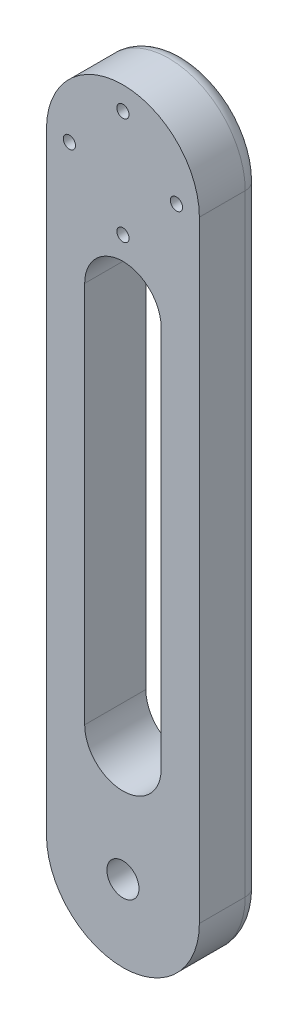
ISO-10303-21;
HEADER;
FILE_DESCRIPTION(('STEP AP214'),'2;1');
FILE_NAME('part.step','',(''),(''),'','','');
FILE_SCHEMA(('AUTOMOTIVE_DESIGN { 1 0 10303 214 1 1 1 1 }'));
ENDSEC;
DATA;
#1=APPLICATION_CONTEXT('core data for automotive mechanical design processes');
#2=APPLICATION_PROTOCOL_DEFINITION('international standard','automotive_design',2000,#1);
#3=PRODUCT_CONTEXT('',#1,'mechanical');
#4=PRODUCT('Part','Part','',(#3));
#5=PRODUCT_RELATED_PRODUCT_CATEGORY('part','',(#4));
#6=PRODUCT_DEFINITION_FORMATION('','',#4);
#7=PRODUCT_DEFINITION_CONTEXT('part definition',#1,'design');
#8=PRODUCT_DEFINITION('design','',#6,#7);
#9=PRODUCT_DEFINITION_SHAPE('','',#8);
#10=(LENGTH_UNIT() NAMED_UNIT(*) SI_UNIT(.MILLI.,.METRE.));
#11=(NAMED_UNIT(*) PLANE_ANGLE_UNIT() SI_UNIT($,.RADIAN.));
#12=(NAMED_UNIT(*) SI_UNIT($,.STERADIAN.) SOLID_ANGLE_UNIT());
#13=UNCERTAINTY_MEASURE_WITH_UNIT(LENGTH_MEASURE(1.E-05),#10,'distance_accuracy_value','');
#14=(GEOMETRIC_REPRESENTATION_CONTEXT(3) GLOBAL_UNCERTAINTY_ASSIGNED_CONTEXT((#13)) GLOBAL_UNIT_ASSIGNED_CONTEXT((#10,
#11,#12)) REPRESENTATION_CONTEXT('',''));
#15=CARTESIAN_POINT('',(0.,0.,0.));
#16=DIRECTION('',(0.,0.,1.));
#17=DIRECTION('',(1.,0.,0.));
#18=AXIS2_PLACEMENT_3D('',#15,#16,#17);
#19=CARTESIAN_POINT('',(0.,-80.,8.));
#20=DIRECTION('',(0.,0.,-1.));
#21=DIRECTION('',(-1.,0.,0.));
#22=AXIS2_PLACEMENT_3D('',#19,#20,#21);
#23=CYLINDRICAL_SURFACE('',#22,10.);
#24=DIRECTION('',(0.,0.,-1.));
#25=VECTOR('',#24,1.);
#26=CARTESIAN_POINT('',(-10.,-80.,8.));
#27=LINE('',#26,#25);
#28=CARTESIAN_POINT('',(-10.,-80.,8.));
#29=VERTEX_POINT('',#28);
#30=CARTESIAN_POINT('',(-10.,-80.,2.));
#31=VERTEX_POINT('',#30);
#32=EDGE_CURVE('E200',#29,#31,#27,.T.);
#33=ORIENTED_EDGE('',*,*,#32,.T.);
#34=CARTESIAN_POINT('',(0.,-80.,2.));
#35=DIRECTION('',(0.,0.,1.));
#36=DIRECTION('',(1.,0.,0.));
#37=AXIS2_PLACEMENT_3D('',#34,#35,#36);
#38=CIRCLE('',#37,10.);
#39=CARTESIAN_POINT('',(10.,-80.,2.));
#40=VERTEX_POINT('',#39);
#41=EDGE_CURVE('E235',#31,#40,#38,.T.);
#42=ORIENTED_EDGE('',*,*,#41,.T.);
#43=DIRECTION('',(0.,0.,-1.));
#44=VECTOR('',#43,1.);
#45=CARTESIAN_POINT('',(10.,-80.,8.));
#46=LINE('',#45,#44);
#47=CARTESIAN_POINT('',(10.,-80.,8.));
#48=VERTEX_POINT('',#47);
#49=EDGE_CURVE('E231',#48,#40,#46,.T.);
#50=ORIENTED_EDGE('',*,*,#49,.F.);
#51=CARTESIAN_POINT('',(0.,-80.,8.));
#52=DIRECTION('',(0.,0.,1.));
#53=DIRECTION('',(1.,0.,0.));
#54=AXIS2_PLACEMENT_3D('',#51,#52,#53);
#55=CIRCLE('',#54,10.);
#56=EDGE_CURVE('E166',#29,#48,#55,.T.);
#57=ORIENTED_EDGE('',*,*,#56,.F.);
#58=EDGE_LOOP('',(#33,#42,#50,#57));
#59=FACE_BOUND('',#58,.T.);
#60=ADVANCED_FACE('F40',(#59),#23,.T.);
#61=CARTESIAN_POINT('',(10.,0.,8.));
#62=DIRECTION('',(-1.,0.,0.));
#63=DIRECTION('',(0.,0.,1.));
#64=AXIS2_PLACEMENT_3D('',#61,#62,#63);
#65=PLANE('',#64);
#66=ORIENTED_EDGE('',*,*,#49,.T.);
#67=DIRECTION('',(0.,1.,0.));
#68=VECTOR('',#67,1.);
#69=CARTESIAN_POINT('',(10.,0.,2.));
#70=LINE('',#69,#68);
#71=CARTESIAN_POINT('',(10.,0.,2.));
#72=VERTEX_POINT('',#71);
#73=EDGE_CURVE('E11',#40,#72,#70,.T.);
#74=ORIENTED_EDGE('',*,*,#73,.T.);
#75=DIRECTION('',(0.,0.,-1.));
#76=VECTOR('',#75,1.);
#77=CARTESIAN_POINT('',(10.,0.,8.));
#78=LINE('',#77,#76);
#79=CARTESIAN_POINT('',(10.,0.,8.));
#80=VERTEX_POINT('',#79);
#81=EDGE_CURVE('E227',#80,#72,#78,.T.);
#82=ORIENTED_EDGE('',*,*,#81,.F.);
#83=DIRECTION('',(0.,1.,0.));
#84=VECTOR('',#83,1.);
#85=CARTESIAN_POINT('',(10.,0.,8.));
#86=LINE('',#85,#84);
#87=EDGE_CURVE('E170',#48,#80,#86,.T.);
#88=ORIENTED_EDGE('',*,*,#87,.F.);
#89=EDGE_LOOP('',(#66,#74,#82,#88));
#90=FACE_BOUND('',#89,.T.);
#91=ADVANCED_FACE('F292',(#90),#65,.F.);
#92=CARTESIAN_POINT('',(0.,0.,8.));
#93=DIRECTION('',(0.,0.,-1.));
#94=DIRECTION('',(-1.,0.,0.));
#95=AXIS2_PLACEMENT_3D('',#92,#93,#94);
#96=CYLINDRICAL_SURFACE('',#95,10.);
#97=ORIENTED_EDGE('',*,*,#81,.T.);
#98=CARTESIAN_POINT('',(0.,0.,2.));
#99=DIRECTION('',(0.,0.,1.));
#100=DIRECTION('',(1.,0.,0.));
#101=AXIS2_PLACEMENT_3D('',#98,#99,#100);
#102=CIRCLE('',#101,10.);
#103=CARTESIAN_POINT('',(-10.,0.,2.));
#104=VERTEX_POINT('',#103);
#105=EDGE_CURVE('E252',#72,#104,#102,.T.);
#106=ORIENTED_EDGE('',*,*,#105,.T.);
#107=DIRECTION('',(0.,0.,-1.));
#108=VECTOR('',#107,1.);
#109=CARTESIAN_POINT('',(-10.,0.,8.));
#110=LINE('',#109,#108);
#111=CARTESIAN_POINT('',(-10.,0.,8.));
#112=VERTEX_POINT('',#111);
#113=EDGE_CURVE('E223',#112,#104,#110,.T.);
#114=ORIENTED_EDGE('',*,*,#113,.F.);
#115=CARTESIAN_POINT('',(0.,0.,8.));
#116=DIRECTION('',(0.,0.,1.));
#117=DIRECTION('',(1.,0.,0.));
#118=AXIS2_PLACEMENT_3D('',#115,#116,#117);
#119=CIRCLE('',#118,10.);
#120=EDGE_CURVE('E174',#80,#112,#119,.T.);
#121=ORIENTED_EDGE('',*,*,#120,.F.);
#122=EDGE_LOOP('',(#97,#106,#114,#121));
#123=FACE_BOUND('',#122,.T.);
#124=ADVANCED_FACE('F302',(#123),#96,.T.);
#125=CARTESIAN_POINT('',(7.,0.,8.));
#126=DIRECTION('',(0.,0.,-1.));
#127=DIRECTION('',(-1.,0.,0.));
#128=AXIS2_PLACEMENT_3D('',#125,#126,#127);
#129=CYLINDRICAL_SURFACE('',#128,0.800000000000001);
#130=CARTESIAN_POINT('',(7.,0.,8.));
#131=DIRECTION('',(0.,0.,1.));
#132=DIRECTION('',(1.,0.,0.));
#133=AXIS2_PLACEMENT_3D('',#130,#131,#132);
#134=CIRCLE('',#133,0.800000000000001);
#135=CARTESIAN_POINT('',(7.8,0.,8.));
#136=VERTEX_POINT('',#135);
#137=EDGE_CURVE('E192',#136,#136,#134,.T.);
#138=ORIENTED_EDGE('',*,*,#137,.T.);
#139=EDGE_LOOP('',(#138));
#140=FACE_BOUND('',#139,.T.);
#141=CARTESIAN_POINT('',(7.,0.,0.));
#142=DIRECTION('',(0.,0.,1.));
#143=DIRECTION('',(1.,0.,0.));
#144=AXIS2_PLACEMENT_3D('',#141,#142,#143);
#145=CIRCLE('',#144,0.800000000000001);
#146=CARTESIAN_POINT('',(7.8,0.,0.));
#147=VERTEX_POINT('',#146);
#148=EDGE_CURVE('E213',#147,#147,#145,.T.);
#149=ORIENTED_EDGE('',*,*,#148,.F.);
#150=EDGE_LOOP('',(#149));
#151=FACE_BOUND('',#150,.T.);
#152=ADVANCED_FACE('F304',(#140,#151),#129,.F.);
#153=CARTESIAN_POINT('',(0.,-7.,8.));
#154=DIRECTION('',(0.,0.,-1.));
#155=DIRECTION('',(-1.,0.,0.));
#156=AXIS2_PLACEMENT_3D('',#153,#154,#155);
#157=CYLINDRICAL_SURFACE('',#156,0.8);
#158=CARTESIAN_POINT('',(0.,-7.,8.));
#159=DIRECTION('',(0.,0.,1.));
#160=DIRECTION('',(1.,0.,0.));
#161=AXIS2_PLACEMENT_3D('',#158,#159,#160);
#162=CIRCLE('',#161,0.8);
#163=CARTESIAN_POINT('',(0.800000000000002,-7.,8.));
#164=VERTEX_POINT('',#163);
#165=EDGE_CURVE('E188',#164,#164,#162,.T.);
#166=ORIENTED_EDGE('',*,*,#165,.T.);
#167=EDGE_LOOP('',(#166));
#168=FACE_BOUND('',#167,.T.);
#169=CARTESIAN_POINT('',(0.,-7.,0.));
#170=DIRECTION('',(0.,0.,1.));
#171=DIRECTION('',(1.,0.,0.));
#172=AXIS2_PLACEMENT_3D('',#169,#170,#171);
#173=CIRCLE('',#172,0.8);
#174=CARTESIAN_POINT('',(0.800000000000002,-7.,0.));
#175=VERTEX_POINT('',#174);
#176=EDGE_CURVE('E209',#175,#175,#173,.T.);
#177=ORIENTED_EDGE('',*,*,#176,.F.);
#178=EDGE_LOOP('',(#177));
#179=FACE_BOUND('',#178,.T.);
#180=ADVANCED_FACE('F310',(#168,#179),#157,.F.);
#181=CARTESIAN_POINT('',(-7.,0.,8.));
#182=DIRECTION('',(0.,0.,-1.));
#183=DIRECTION('',(-1.,0.,0.));
#184=AXIS2_PLACEMENT_3D('',#181,#182,#183);
#185=CYLINDRICAL_SURFACE('',#184,0.800000000000001);
#186=CARTESIAN_POINT('',(-7.,0.,8.));
#187=DIRECTION('',(0.,0.,1.));
#188=DIRECTION('',(1.,0.,0.));
#189=AXIS2_PLACEMENT_3D('',#186,#187,#188);
#190=CIRCLE('',#189,0.800000000000001);
#191=CARTESIAN_POINT('',(-6.2,0.,8.));
#192=VERTEX_POINT('',#191);
#193=EDGE_CURVE('E184',#192,#192,#190,.T.);
#194=ORIENTED_EDGE('',*,*,#193,.T.);
#195=EDGE_LOOP('',(#194));
#196=FACE_BOUND('',#195,.T.);
#197=CARTESIAN_POINT('',(-7.,0.,0.));
#198=DIRECTION('',(0.,0.,1.));
#199=DIRECTION('',(1.,0.,0.));
#200=AXIS2_PLACEMENT_3D('',#197,#198,#199);
#201=CIRCLE('',#200,0.800000000000001);
#202=CARTESIAN_POINT('',(-6.2,0.,0.));
#203=VERTEX_POINT('',#202);
#204=EDGE_CURVE('E205',#203,#203,#201,.T.);
#205=ORIENTED_EDGE('',*,*,#204,.F.);
#206=EDGE_LOOP('',(#205));
#207=FACE_BOUND('',#206,.T.);
#208=ADVANCED_FACE('F346',(#196,#207),#185,.F.);
#209=CARTESIAN_POINT('',(0.,-80.,8.));
#210=DIRECTION('',(0.,0.,-1.));
#211=DIRECTION('',(-1.,0.,0.));
#212=AXIS2_PLACEMENT_3D('',#209,#210,#211);
#213=CYLINDRICAL_SURFACE('',#212,2.1);
#214=CARTESIAN_POINT('',(0.,-80.,8.));
#215=DIRECTION('',(0.,0.,1.));
#216=DIRECTION('',(1.,0.,0.));
#217=AXIS2_PLACEMENT_3D('',#214,#215,#216);
#218=CIRCLE('',#217,2.1);
#219=CARTESIAN_POINT('',(2.1,-80.,8.));
#220=VERTEX_POINT('',#219);
#221=EDGE_CURVE('E180',#220,#220,#218,.T.);
#222=ORIENTED_EDGE('',*,*,#221,.T.);
#223=EDGE_LOOP('',(#222));
#224=FACE_BOUND('',#223,.T.);
#225=CARTESIAN_POINT('',(0.,-80.,0.));
#226=DIRECTION('',(0.,0.,1.));
#227=DIRECTION('',(1.,0.,0.));
#228=AXIS2_PLACEMENT_3D('',#225,#226,#227);
#229=CIRCLE('',#228,2.1);
#230=CARTESIAN_POINT('',(2.1,-80.,0.));
#231=VERTEX_POINT('',#230);
#232=EDGE_CURVE('E201',#231,#231,#229,.T.);
#233=ORIENTED_EDGE('',*,*,#232,.F.);
#234=EDGE_LOOP('',(#233));
#235=FACE_BOUND('',#234,.T.);
#236=ADVANCED_FACE('F350',(#224,#235),#213,.F.);
#237=CARTESIAN_POINT('',(-10.,0.,8.));
#238=DIRECTION('',(1.,0.,0.));
#239=DIRECTION('',(0.,0.,-1.));
#240=AXIS2_PLACEMENT_3D('',#237,#238,#239);
#241=PLANE('',#240);
#242=ORIENTED_EDGE('',*,*,#113,.T.);
#243=DIRECTION('',(0.,-1.,0.));
#244=VECTOR('',#243,1.);
#245=CARTESIAN_POINT('',(-10.,0.,2.));
#246=LINE('',#245,#244);
#247=EDGE_CURVE('E50',#104,#31,#246,.T.);
#248=ORIENTED_EDGE('',*,*,#247,.T.);
#249=ORIENTED_EDGE('',*,*,#32,.F.);
#250=DIRECTION('',(0.,-1.,0.));
#251=VECTOR('',#250,1.);
#252=CARTESIAN_POINT('',(-10.,0.,8.));
#253=LINE('',#252,#251);
#254=EDGE_CURVE('E177',#112,#29,#253,.T.);
#255=ORIENTED_EDGE('',*,*,#254,.F.);
#256=EDGE_LOOP('',(#242,#248,#249,#255));
#257=FACE_BOUND('',#256,.T.);
#258=ADVANCED_FACE('F300',(#257),#241,.F.);
#259=CARTESIAN_POINT('',(0.,7.,8.));
#260=DIRECTION('',(0.,0.,-1.));
#261=DIRECTION('',(-1.,0.,0.));
#262=AXIS2_PLACEMENT_3D('',#259,#260,#261);
#263=CYLINDRICAL_SURFACE('',#262,0.8);
#264=CARTESIAN_POINT('',(0.,7.,8.));
#265=DIRECTION('',(0.,0.,1.));
#266=DIRECTION('',(1.,0.,0.));
#267=AXIS2_PLACEMENT_3D('',#264,#265,#266);
#268=CIRCLE('',#267,0.8);
#269=CARTESIAN_POINT('',(0.799999999999999,7.,8.));
#270=VERTEX_POINT('',#269);
#271=EDGE_CURVE('E196',#270,#270,#268,.T.);
#272=ORIENTED_EDGE('',*,*,#271,.T.);
#273=EDGE_LOOP('',(#272));
#274=FACE_BOUND('',#273,.T.);
#275=CARTESIAN_POINT('',(0.,7.,0.));
#276=DIRECTION('',(0.,0.,1.));
#277=DIRECTION('',(1.,0.,0.));
#278=AXIS2_PLACEMENT_3D('',#275,#276,#277);
#279=CIRCLE('',#278,0.8);
#280=CARTESIAN_POINT('',(0.799999999999999,7.,0.));
#281=VERTEX_POINT('',#280);
#282=EDGE_CURVE('E171',#281,#281,#279,.T.);
#283=ORIENTED_EDGE('',*,*,#282,.F.);
#284=EDGE_LOOP('',(#283));
#285=FACE_BOUND('',#284,.T.);
#286=ADVANCED_FACE('F336',(#274,#285),#263,.F.);
#287=CARTESIAN_POINT('',(0.,0.,8.));
#288=DIRECTION('',(0.,0.,1.));
#289=DIRECTION('',(1.,0.,0.));
#290=AXIS2_PLACEMENT_3D('',#287,#288,#289);
#291=PLANE('',#290);
#292=CARTESIAN_POINT('',(0.,-65.,8.));
#293=DIRECTION('',(0.,0.,1.));
#294=DIRECTION('',(1.,0.,0.));
#295=AXIS2_PLACEMENT_3D('',#292,#293,#294);
#296=CIRCLE('',#295,5.);
#297=CARTESIAN_POINT('',(-5.00000000000001,-65.,8.));
#298=VERTEX_POINT('',#297);
#299=CARTESIAN_POINT('',(4.99999999999999,-65.,8.));
#300=VERTEX_POINT('',#299);
#301=EDGE_CURVE('E162',#298,#300,#296,.T.);
#302=ORIENTED_EDGE('',*,*,#301,.F.);
#303=DIRECTION('',(0.,-1.,0.));
#304=VECTOR('',#303,1.);
#305=CARTESIAN_POINT('',(-5.00000000000001,0.,8.));
#306=LINE('',#305,#304);
#307=CARTESIAN_POINT('',(-5.00000000000001,-15.,8.));
#308=VERTEX_POINT('',#307);
#309=EDGE_CURVE('E150',#308,#298,#306,.T.);
#310=ORIENTED_EDGE('',*,*,#309,.F.);
#311=CARTESIAN_POINT('',(0.,-15.,8.));
#312=DIRECTION('',(0.,0.,1.));
#313=DIRECTION('',(1.,0.,0.));
#314=AXIS2_PLACEMENT_3D('',#311,#312,#313);
#315=CIRCLE('',#314,5.);
#316=CARTESIAN_POINT('',(4.99999999999999,-15.,8.));
#317=VERTEX_POINT('',#316);
#318=EDGE_CURVE('E125',#317,#308,#315,.T.);
#319=ORIENTED_EDGE('',*,*,#318,.F.);
#320=DIRECTION('',(0.,1.,0.));
#321=VECTOR('',#320,1.);
#322=CARTESIAN_POINT('',(4.99999999999999,0.,8.));
#323=LINE('',#322,#321);
#324=EDGE_CURVE('E159',#300,#317,#323,.T.);
#325=ORIENTED_EDGE('',*,*,#324,.F.);
#326=EDGE_LOOP('',(#302,#310,#319,#325));
#327=FACE_BOUND('',#326,.T.);
#328=ORIENTED_EDGE('',*,*,#56,.T.);
#329=ORIENTED_EDGE('',*,*,#87,.T.);
#330=ORIENTED_EDGE('',*,*,#120,.T.);
#331=ORIENTED_EDGE('',*,*,#254,.T.);
#332=EDGE_LOOP('',(#328,#329,#330,#331));
#333=FACE_BOUND('',#332,.T.);
#334=ORIENTED_EDGE('',*,*,#221,.F.);
#335=EDGE_LOOP('',(#334));
#336=FACE_BOUND('',#335,.T.);
#337=ORIENTED_EDGE('',*,*,#193,.F.);
#338=EDGE_LOOP('',(#337));
#339=FACE_BOUND('',#338,.T.);
#340=ORIENTED_EDGE('',*,*,#165,.F.);
#341=EDGE_LOOP('',(#340));
#342=FACE_BOUND('',#341,.T.);
#343=ORIENTED_EDGE('',*,*,#137,.F.);
#344=EDGE_LOOP('',(#343));
#345=FACE_BOUND('',#344,.T.);
#346=ORIENTED_EDGE('',*,*,#271,.F.);
#347=EDGE_LOOP('',(#346));
#348=FACE_BOUND('',#347,.T.);
#349=ADVANCED_FACE('F295',(#327,#333,#336,#339,#342,#345,#348),#291,.T.);
#350=CARTESIAN_POINT('',(0.,0.,0.));
#351=DIRECTION('',(0.,0.,1.));
#352=DIRECTION('',(1.,0.,0.));
#353=AXIS2_PLACEMENT_3D('',#350,#351,#352);
#354=PLANE('',#353);
#355=DIRECTION('',(0.,1.,0.));
#356=VECTOR('',#355,1.);
#357=CARTESIAN_POINT('',(-5.00000000000001,-65.,0.));
#358=LINE('',#357,#356);
#359=CARTESIAN_POINT('',(-5.00000000000001,-65.,0.));
#360=VERTEX_POINT('',#359);
#361=CARTESIAN_POINT('',(-5.00000000000001,-15.,0.));
#362=VERTEX_POINT('',#361);
#363=EDGE_CURVE('E132',#360,#362,#358,.T.);
#364=ORIENTED_EDGE('',*,*,#363,.F.);
#365=CARTESIAN_POINT('',(0.,-65.,0.));
#366=DIRECTION('',(0.,0.,-1.));
#367=DIRECTION('',(-1.,0.,0.));
#368=AXIS2_PLACEMENT_3D('',#365,#366,#367);
#369=CIRCLE('',#368,5.);
#370=CARTESIAN_POINT('',(4.99999999999999,-65.,0.));
#371=VERTEX_POINT('',#370);
#372=EDGE_CURVE('E66',#371,#360,#369,.T.);
#373=ORIENTED_EDGE('',*,*,#372,.F.);
#374=DIRECTION('',(0.,-1.,0.));
#375=VECTOR('',#374,1.);
#376=CARTESIAN_POINT('',(4.99999999999999,-65.,0.));
#377=LINE('',#376,#375);
#378=CARTESIAN_POINT('',(4.99999999999999,-15.,0.));
#379=VERTEX_POINT('',#378);
#380=EDGE_CURVE('E140',#379,#371,#377,.T.);
#381=ORIENTED_EDGE('',*,*,#380,.F.);
#382=CARTESIAN_POINT('',(0.,-15.,0.));
#383=DIRECTION('',(0.,0.,-1.));
#384=DIRECTION('',(-1.,0.,0.));
#385=AXIS2_PLACEMENT_3D('',#382,#383,#384);
#386=CIRCLE('',#385,5.);
#387=EDGE_CURVE('E122',#362,#379,#386,.T.);
#388=ORIENTED_EDGE('',*,*,#387,.F.);
#389=EDGE_LOOP('',(#364,#373,#381,#388));
#390=FACE_BOUND('',#389,.T.);
#391=CARTESIAN_POINT('',(0.,-80.,0.));
#392=DIRECTION('',(0.,0.,1.));
#393=DIRECTION('',(1.,0.,0.));
#394=AXIS2_PLACEMENT_3D('',#391,#392,#393);
#395=CIRCLE('',#394,8.);
#396=CARTESIAN_POINT('',(8.,-80.,0.));
#397=VERTEX_POINT('',#396);
#398=CARTESIAN_POINT('',(-8.,-80.,0.));
#399=VERTEX_POINT('',#398);
#400=EDGE_CURVE('E245',#397,#399,#395,.F.);
#401=ORIENTED_EDGE('',*,*,#400,.T.);
#402=DIRECTION('',(0.,-1.,0.));
#403=VECTOR('',#402,1.);
#404=CARTESIAN_POINT('',(-8.,0.,0.));
#405=LINE('',#404,#403);
#406=CARTESIAN_POINT('',(-8.,0.,0.));
#407=VERTEX_POINT('',#406);
#408=EDGE_CURVE('E249',#399,#407,#405,.F.);
#409=ORIENTED_EDGE('',*,*,#408,.T.);
#410=CARTESIAN_POINT('',(0.,0.,0.));
#411=DIRECTION('',(0.,0.,1.));
#412=DIRECTION('',(1.,0.,0.));
#413=AXIS2_PLACEMENT_3D('',#410,#411,#412);
#414=CIRCLE('',#413,8.);
#415=CARTESIAN_POINT('',(8.,0.,0.));
#416=VERTEX_POINT('',#415);
#417=EDGE_CURVE('E242',#407,#416,#414,.F.);
#418=ORIENTED_EDGE('',*,*,#417,.T.);
#419=DIRECTION('',(0.,1.,0.));
#420=VECTOR('',#419,1.);
#421=CARTESIAN_POINT('',(8.,0.,0.));
#422=LINE('',#421,#420);
#423=EDGE_CURVE('E239',#416,#397,#422,.F.);
#424=ORIENTED_EDGE('',*,*,#423,.T.);
#425=EDGE_LOOP('',(#401,#409,#418,#424));
#426=FACE_BOUND('',#425,.T.);
#427=ORIENTED_EDGE('',*,*,#232,.T.);
#428=EDGE_LOOP('',(#427));
#429=FACE_BOUND('',#428,.T.);
#430=ORIENTED_EDGE('',*,*,#204,.T.);
#431=EDGE_LOOP('',(#430));
#432=FACE_BOUND('',#431,.T.);
#433=ORIENTED_EDGE('',*,*,#176,.T.);
#434=EDGE_LOOP('',(#433));
#435=FACE_BOUND('',#434,.T.);
#436=ORIENTED_EDGE('',*,*,#148,.T.);
#437=EDGE_LOOP('',(#436));
#438=FACE_BOUND('',#437,.T.);
#439=ORIENTED_EDGE('',*,*,#282,.T.);
#440=EDGE_LOOP('',(#439));
#441=FACE_BOUND('',#440,.T.);
#442=ADVANCED_FACE('F137',(#390,#426,#429,#432,#435,#438,#441),#354,.F.);
#443=CARTESIAN_POINT('',(0.,0.,2.));
#444=DIRECTION('',(0.,0.,1.));
#445=DIRECTION('',(1.,0.,0.));
#446=AXIS2_PLACEMENT_3D('',#443,#444,#445);
#447=TOROIDAL_SURFACE('',#446,8.,2.);
#448=CARTESIAN_POINT('',(8.,0.,2.));
#449=DIRECTION('',(0.,-1.,0.));
#450=DIRECTION('',(0.,0.,-1.));
#451=AXIS2_PLACEMENT_3D('',#448,#449,#450);
#452=CIRCLE('',#451,2.);
#453=EDGE_CURVE('E261',#416,#72,#452,.T.);
#454=ORIENTED_EDGE('',*,*,#453,.F.);
#455=ORIENTED_EDGE('',*,*,#417,.F.);
#456=CARTESIAN_POINT('',(-8.,0.,2.));
#457=DIRECTION('',(0.,-1.,0.));
#458=DIRECTION('',(0.,0.,-1.));
#459=AXIS2_PLACEMENT_3D('',#456,#457,#458);
#460=CIRCLE('',#459,2.);
#461=EDGE_CURVE('E44',#104,#407,#460,.T.);
#462=ORIENTED_EDGE('',*,*,#461,.F.);
#463=ORIENTED_EDGE('',*,*,#105,.F.);
#464=EDGE_LOOP('',(#454,#455,#462,#463));
#465=FACE_BOUND('',#464,.T.);
#466=ADVANCED_FACE('F42',(#465),#447,.T.);
#467=CARTESIAN_POINT('',(-8.,0.,2.));
#468=DIRECTION('',(0.,-1.,0.));
#469=DIRECTION('',(0.,0.,-1.));
#470=AXIS2_PLACEMENT_3D('',#467,#468,#469);
#471=CYLINDRICAL_SURFACE('',#470,2.);
#472=ORIENTED_EDGE('',*,*,#461,.T.);
#473=ORIENTED_EDGE('',*,*,#408,.F.);
#474=CARTESIAN_POINT('',(-8.,-80.,2.));
#475=DIRECTION('',(0.,-1.,0.));
#476=DIRECTION('',(0.,0.,-1.));
#477=AXIS2_PLACEMENT_3D('',#474,#475,#476);
#478=CIRCLE('',#477,2.);
#479=EDGE_CURVE('E259',#31,#399,#478,.T.);
#480=ORIENTED_EDGE('',*,*,#479,.F.);
#481=ORIENTED_EDGE('',*,*,#247,.F.);
#482=EDGE_LOOP('',(#472,#473,#480,#481));
#483=FACE_BOUND('',#482,.T.);
#484=ADVANCED_FACE('F274',(#483),#471,.T.);
#485=CARTESIAN_POINT('',(8.,0.,2.));
#486=DIRECTION('',(0.,1.,0.));
#487=DIRECTION('',(0.,0.,1.));
#488=AXIS2_PLACEMENT_3D('',#485,#486,#487);
#489=CYLINDRICAL_SURFACE('',#488,2.);
#490=ORIENTED_EDGE('',*,*,#453,.T.);
#491=ORIENTED_EDGE('',*,*,#73,.F.);
#492=CARTESIAN_POINT('',(8.,-80.,2.));
#493=DIRECTION('',(0.,-1.,0.));
#494=DIRECTION('',(0.,0.,-1.));
#495=AXIS2_PLACEMENT_3D('',#492,#493,#494);
#496=CIRCLE('',#495,2.);
#497=EDGE_CURVE('E165',#397,#40,#496,.T.);
#498=ORIENTED_EDGE('',*,*,#497,.F.);
#499=ORIENTED_EDGE('',*,*,#423,.F.);
#500=EDGE_LOOP('',(#490,#491,#498,#499));
#501=FACE_BOUND('',#500,.T.);
#502=ADVANCED_FACE('F285',(#501),#489,.T.);
#503=CARTESIAN_POINT('',(0.,-80.,2.));
#504=DIRECTION('',(0.,0.,1.));
#505=DIRECTION('',(1.,0.,0.));
#506=AXIS2_PLACEMENT_3D('',#503,#504,#505);
#507=TOROIDAL_SURFACE('',#506,8.,2.);
#508=ORIENTED_EDGE('',*,*,#479,.T.);
#509=ORIENTED_EDGE('',*,*,#400,.F.);
#510=ORIENTED_EDGE('',*,*,#497,.T.);
#511=ORIENTED_EDGE('',*,*,#41,.F.);
#512=EDGE_LOOP('',(#508,#509,#510,#511));
#513=FACE_BOUND('',#512,.T.);
#514=ADVANCED_FACE('F283',(#513),#507,.T.);
#515=CARTESIAN_POINT('',(0.,-65.,60.));
#516=DIRECTION('',(0.,0.,-1.));
#517=DIRECTION('',(-1.,0.,0.));
#518=AXIS2_PLACEMENT_3D('',#515,#516,#517);
#519=CYLINDRICAL_SURFACE('',#518,5.);
#520=ORIENTED_EDGE('',*,*,#301,.T.);
#521=DIRECTION('',(0.,0.,-1.));
#522=VECTOR('',#521,1.);
#523=CARTESIAN_POINT('',(4.99999999999999,-65.,60.));
#524=LINE('',#523,#522);
#525=EDGE_CURVE('E147',#300,#371,#524,.T.);
#526=ORIENTED_EDGE('',*,*,#525,.T.);
#527=ORIENTED_EDGE('',*,*,#372,.T.);
#528=DIRECTION('',(0.,0.,-1.));
#529=VECTOR('',#528,1.);
#530=CARTESIAN_POINT('',(-5.00000000000001,-65.,60.));
#531=LINE('',#530,#529);
#532=EDGE_CURVE('E129',#298,#360,#531,.T.);
#533=ORIENTED_EDGE('',*,*,#532,.F.);
#534=EDGE_LOOP('',(#520,#526,#527,#533));
#535=FACE_BOUND('',#534,.T.);
#536=ADVANCED_FACE('F322',(#535),#519,.F.);
#537=CARTESIAN_POINT('',(4.99999999999999,-65.,60.));
#538=DIRECTION('',(1.,0.,0.));
#539=DIRECTION('',(0.,0.,-1.));
#540=AXIS2_PLACEMENT_3D('',#537,#538,#539);
#541=PLANE('',#540);
#542=ORIENTED_EDGE('',*,*,#324,.T.);
#543=DIRECTION('',(0.,0.,-1.));
#544=VECTOR('',#543,1.);
#545=CARTESIAN_POINT('',(4.99999999999999,-15.,60.));
#546=LINE('',#545,#544);
#547=EDGE_CURVE('E128',#317,#379,#546,.T.);
#548=ORIENTED_EDGE('',*,*,#547,.T.);
#549=ORIENTED_EDGE('',*,*,#380,.T.);
#550=ORIENTED_EDGE('',*,*,#525,.F.);
#551=EDGE_LOOP('',(#542,#548,#549,#550));
#552=FACE_BOUND('',#551,.T.);
#553=ADVANCED_FACE('F404',(#552),#541,.F.);
#554=CARTESIAN_POINT('',(0.,-15.,60.));
#555=DIRECTION('',(0.,0.,-1.));
#556=DIRECTION('',(-1.,0.,0.));
#557=AXIS2_PLACEMENT_3D('',#554,#555,#556);
#558=CYLINDRICAL_SURFACE('',#557,5.);
#559=ORIENTED_EDGE('',*,*,#318,.T.);
#560=DIRECTION('',(0.,0.,-1.));
#561=VECTOR('',#560,1.);
#562=CARTESIAN_POINT('',(-5.00000000000001,-15.,60.));
#563=LINE('',#562,#561);
#564=EDGE_CURVE('E58',#308,#362,#563,.T.);
#565=ORIENTED_EDGE('',*,*,#564,.T.);
#566=ORIENTED_EDGE('',*,*,#387,.T.);
#567=ORIENTED_EDGE('',*,*,#547,.F.);
#568=EDGE_LOOP('',(#559,#565,#566,#567));
#569=FACE_BOUND('',#568,.T.);
#570=ADVANCED_FACE('F119',(#569),#558,.F.);
#571=CARTESIAN_POINT('',(-5.00000000000001,-65.,60.));
#572=DIRECTION('',(-1.,0.,0.));
#573=DIRECTION('',(0.,0.,1.));
#574=AXIS2_PLACEMENT_3D('',#571,#572,#573);
#575=PLANE('',#574);
#576=ORIENTED_EDGE('',*,*,#309,.T.);
#577=ORIENTED_EDGE('',*,*,#532,.T.);
#578=ORIENTED_EDGE('',*,*,#363,.T.);
#579=ORIENTED_EDGE('',*,*,#564,.F.);
#580=EDGE_LOOP('',(#576,#577,#578,#579));
#581=FACE_BOUND('',#580,.T.);
#582=ADVANCED_FACE('F133',(#581),#575,.F.);
#583=CLOSED_SHELL('',(#60,#91,#124,#152,#180,#208,#236,#258,#286,#349,#442,#466,#484,#502,#514,
#536,#553,#570,#582));
#584=MANIFOLD_SOLID_BREP('B2',#583);
#585=ADVANCED_BREP_SHAPE_REPRESENTATION('',(#18,#584),#14);
#586=SHAPE_DEFINITION_REPRESENTATION(#9,#585);
ENDSEC;
END-ISO-10303-21;
